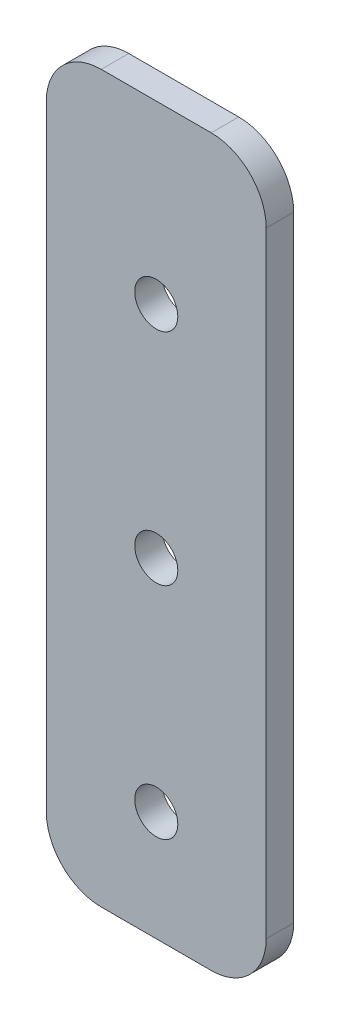
ISO-10303-21;
HEADER;
FILE_DESCRIPTION(('STEP AP214'),'2;1');
FILE_NAME('part.step','',(''),(''),'','','');
FILE_SCHEMA(('AUTOMOTIVE_DESIGN { 1 0 10303 214 1 1 1 1 }'));
ENDSEC;
DATA;
#1=APPLICATION_CONTEXT('core data for automotive mechanical design processes');
#2=APPLICATION_PROTOCOL_DEFINITION('international standard','automotive_design',2000,#1);
#3=PRODUCT_CONTEXT('',#1,'mechanical');
#4=PRODUCT('Part','Part','',(#3));
#5=PRODUCT_RELATED_PRODUCT_CATEGORY('part','',(#4));
#6=PRODUCT_DEFINITION_FORMATION('','',#4);
#7=PRODUCT_DEFINITION_CONTEXT('part definition',#1,'design');
#8=PRODUCT_DEFINITION('design','',#6,#7);
#9=PRODUCT_DEFINITION_SHAPE('','',#8);
#10=(LENGTH_UNIT() NAMED_UNIT(*) SI_UNIT(.MILLI.,.METRE.));
#11=(NAMED_UNIT(*) PLANE_ANGLE_UNIT() SI_UNIT($,.RADIAN.));
#12=(NAMED_UNIT(*) SI_UNIT($,.STERADIAN.) SOLID_ANGLE_UNIT());
#13=UNCERTAINTY_MEASURE_WITH_UNIT(LENGTH_MEASURE(1.E-05),#10,'distance_accuracy_value','');
#14=(GEOMETRIC_REPRESENTATION_CONTEXT(3) GLOBAL_UNCERTAINTY_ASSIGNED_CONTEXT((#13)) GLOBAL_UNIT_ASSIGNED_CONTEXT((#10,
#11,#12)) REPRESENTATION_CONTEXT('',''));
#15=CARTESIAN_POINT('',(0.,0.,0.));
#16=DIRECTION('',(0.,0.,1.));
#17=DIRECTION('',(1.,0.,0.));
#18=AXIS2_PLACEMENT_3D('',#15,#16,#17);
#19=CARTESIAN_POINT('',(0.,0.,3.175));
#20=DIRECTION('',(1.,0.,0.));
#21=DIRECTION('',(0.,1.,0.));
#22=AXIS2_PLACEMENT_3D('',#19,#20,#21);
#23=PLANE('',#22);
#24=DIRECTION('',(0.,-1.,0.));
#25=VECTOR('',#24,1.);
#26=CARTESIAN_POINT('',(0.,0.,0.));
#27=LINE('',#26,#25);
#28=CARTESIAN_POINT('',(0.,77.47,0.));
#29=VERTEX_POINT('',#28);
#30=CARTESIAN_POINT('',(0.,6.35,0.));
#31=VERTEX_POINT('',#30);
#32=EDGE_CURVE('E163',#29,#31,#27,.T.);
#33=ORIENTED_EDGE('',*,*,#32,.T.);
#34=DIRECTION('',(0.,0.,-1.));
#35=VECTOR('',#34,1.);
#36=CARTESIAN_POINT('',(0.,6.35,3.175));
#37=LINE('',#36,#35);
#38=CARTESIAN_POINT('',(0.,6.35,3.175));
#39=VERTEX_POINT('',#38);
#40=EDGE_CURVE('E11',#31,#39,#37,.F.);
#41=ORIENTED_EDGE('',*,*,#40,.T.);
#42=DIRECTION('',(0.,-1.,0.));
#43=VECTOR('',#42,1.);
#44=CARTESIAN_POINT('',(0.,0.,3.175));
#45=LINE('',#44,#43);
#46=CARTESIAN_POINT('',(0.,77.47,3.175));
#47=VERTEX_POINT('',#46);
#48=EDGE_CURVE('E131',#47,#39,#45,.T.);
#49=ORIENTED_EDGE('',*,*,#48,.F.);
#50=DIRECTION('',(0.,0.,-1.));
#51=VECTOR('',#50,1.);
#52=CARTESIAN_POINT('',(0.,77.47,3.175));
#53=LINE('',#52,#51);
#54=EDGE_CURVE('E47',#47,#29,#53,.T.);
#55=ORIENTED_EDGE('',*,*,#54,.T.);
#56=EDGE_LOOP('',(#33,#41,#49,#55));
#57=FACE_BOUND('',#56,.T.);
#58=ADVANCED_FACE('F39',(#57),#23,.F.);
#59=CARTESIAN_POINT('',(0.,0.,3.175));
#60=DIRECTION('',(0.,1.,0.));
#61=DIRECTION('',(0.,0.,1.));
#62=AXIS2_PLACEMENT_3D('',#59,#60,#61);
#63=PLANE('',#62);
#64=DIRECTION('',(1.,0.,0.));
#65=VECTOR('',#64,1.);
#66=CARTESIAN_POINT('',(0.,0.,0.));
#67=LINE('',#66,#65);
#68=CARTESIAN_POINT('',(6.35,0.,0.));
#69=VERTEX_POINT('',#68);
#70=CARTESIAN_POINT('',(19.05,0.,0.));
#71=VERTEX_POINT('',#70);
#72=EDGE_CURVE('E136',#69,#71,#67,.T.);
#73=ORIENTED_EDGE('',*,*,#72,.T.);
#74=DIRECTION('',(0.,0.,-1.));
#75=VECTOR('',#74,1.);
#76=CARTESIAN_POINT('',(19.05,0.,3.175));
#77=LINE('',#76,#75);
#78=CARTESIAN_POINT('',(19.05,0.,3.175));
#79=VERTEX_POINT('',#78);
#80=EDGE_CURVE('E54',#71,#79,#77,.F.);
#81=ORIENTED_EDGE('',*,*,#80,.T.);
#82=DIRECTION('',(1.,0.,0.));
#83=VECTOR('',#82,1.);
#84=CARTESIAN_POINT('',(0.,0.,3.175));
#85=LINE('',#84,#83);
#86=CARTESIAN_POINT('',(6.35,0.,3.175));
#87=VERTEX_POINT('',#86);
#88=EDGE_CURVE('E134',#87,#79,#85,.T.);
#89=ORIENTED_EDGE('',*,*,#88,.F.);
#90=DIRECTION('',(0.,0.,-1.));
#91=VECTOR('',#90,1.);
#92=CARTESIAN_POINT('',(6.35,0.,3.175));
#93=LINE('',#92,#91);
#94=EDGE_CURVE('E155',#87,#69,#93,.T.);
#95=ORIENTED_EDGE('',*,*,#94,.T.);
#96=EDGE_LOOP('',(#73,#81,#89,#95));
#97=FACE_BOUND('',#96,.T.);
#98=ADVANCED_FACE('F210',(#97),#63,.F.);
#99=CARTESIAN_POINT('',(25.4,0.,3.175));
#100=DIRECTION('',(-1.,0.,0.));
#101=DIRECTION('',(0.,-1.,0.));
#102=AXIS2_PLACEMENT_3D('',#99,#100,#101);
#103=PLANE('',#102);
#104=DIRECTION('',(0.,1.,0.));
#105=VECTOR('',#104,1.);
#106=CARTESIAN_POINT('',(25.4,0.,0.));
#107=LINE('',#106,#105);
#108=CARTESIAN_POINT('',(25.4,6.35,0.));
#109=VERTEX_POINT('',#108);
#110=CARTESIAN_POINT('',(25.4,77.47,0.));
#111=VERTEX_POINT('',#110);
#112=EDGE_CURVE('E132',#109,#111,#107,.T.);
#113=ORIENTED_EDGE('',*,*,#112,.T.);
#114=DIRECTION('',(0.,0.,-1.));
#115=VECTOR('',#114,1.);
#116=CARTESIAN_POINT('',(25.4,77.47,3.175));
#117=LINE('',#116,#115);
#118=CARTESIAN_POINT('',(25.4,77.47,3.175));
#119=VERTEX_POINT('',#118);
#120=EDGE_CURVE('E110',#111,#119,#117,.F.);
#121=ORIENTED_EDGE('',*,*,#120,.T.);
#122=DIRECTION('',(0.,1.,0.));
#123=VECTOR('',#122,1.);
#124=CARTESIAN_POINT('',(25.4,0.,3.175));
#125=LINE('',#124,#123);
#126=CARTESIAN_POINT('',(25.4,6.35,3.175));
#127=VERTEX_POINT('',#126);
#128=EDGE_CURVE('E175',#127,#119,#125,.T.);
#129=ORIENTED_EDGE('',*,*,#128,.F.);
#130=DIRECTION('',(0.,0.,-1.));
#131=VECTOR('',#130,1.);
#132=CARTESIAN_POINT('',(25.4,6.35,3.175));
#133=LINE('',#132,#131);
#134=EDGE_CURVE('E115',#127,#109,#133,.T.);
#135=ORIENTED_EDGE('',*,*,#134,.T.);
#136=EDGE_LOOP('',(#113,#121,#129,#135));
#137=FACE_BOUND('',#136,.T.);
#138=ADVANCED_FACE('F207',(#137),#103,.F.);
#139=CARTESIAN_POINT('',(0.,83.82,3.175));
#140=DIRECTION('',(0.,-1.,0.));
#141=DIRECTION('',(0.,0.,-1.));
#142=AXIS2_PLACEMENT_3D('',#139,#140,#141);
#143=PLANE('',#142);
#144=DIRECTION('',(-1.,0.,0.));
#145=VECTOR('',#144,1.);
#146=CARTESIAN_POINT('',(0.,83.82,3.175));
#147=LINE('',#146,#145);
#148=CARTESIAN_POINT('',(19.05,83.82,3.175));
#149=VERTEX_POINT('',#148);
#150=CARTESIAN_POINT('',(6.34999999999999,83.82,3.175));
#151=VERTEX_POINT('',#150);
#152=EDGE_CURVE('E125',#149,#151,#147,.T.);
#153=ORIENTED_EDGE('',*,*,#152,.F.);
#154=DIRECTION('',(0.,0.,-1.));
#155=VECTOR('',#154,1.);
#156=CARTESIAN_POINT('',(19.05,83.82,3.175));
#157=LINE('',#156,#155);
#158=CARTESIAN_POINT('',(19.05,83.82,0.));
#159=VERTEX_POINT('',#158);
#160=EDGE_CURVE('E109',#149,#159,#157,.T.);
#161=ORIENTED_EDGE('',*,*,#160,.T.);
#162=DIRECTION('',(-1.,0.,0.));
#163=VECTOR('',#162,1.);
#164=CARTESIAN_POINT('',(0.,83.82,0.));
#165=LINE('',#164,#163);
#166=CARTESIAN_POINT('',(6.34999999999999,83.82,0.));
#167=VERTEX_POINT('',#166);
#168=EDGE_CURVE('E122',#159,#167,#165,.T.);
#169=ORIENTED_EDGE('',*,*,#168,.T.);
#170=DIRECTION('',(0.,0.,-1.));
#171=VECTOR('',#170,1.);
#172=CARTESIAN_POINT('',(6.34999999999999,83.82,3.175));
#173=LINE('',#172,#171);
#174=EDGE_CURVE('E127',#167,#151,#173,.F.);
#175=ORIENTED_EDGE('',*,*,#174,.T.);
#176=EDGE_LOOP('',(#153,#161,#169,#175));
#177=FACE_BOUND('',#176,.T.);
#178=ADVANCED_FACE('F121',(#177),#143,.F.);
#179=CARTESIAN_POINT('',(0.,0.,3.175));
#180=DIRECTION('',(0.,0.,-1.));
#181=DIRECTION('',(-1.,0.,0.));
#182=AXIS2_PLACEMENT_3D('',#179,#180,#181);
#183=PLANE('',#182);
#184=CARTESIAN_POINT('',(12.7,12.7,3.175));
#185=DIRECTION('',(0.,0.,1.));
#186=DIRECTION('',(1.,0.,0.));
#187=AXIS2_PLACEMENT_3D('',#184,#185,#186);
#188=CIRCLE('',#187,2.4892);
#189=CARTESIAN_POINT('',(15.1892,12.7,3.175));
#190=VERTEX_POINT('',#189);
#191=EDGE_CURVE('E171',#190,#190,#188,.T.);
#192=ORIENTED_EDGE('',*,*,#191,.F.);
#193=EDGE_LOOP('',(#192));
#194=FACE_BOUND('',#193,.T.);
#195=CARTESIAN_POINT('',(12.7,38.1,3.175));
#196=DIRECTION('',(0.,0.,1.));
#197=DIRECTION('',(1.,0.,0.));
#198=AXIS2_PLACEMENT_3D('',#195,#196,#197);
#199=CIRCLE('',#198,2.4892);
#200=CARTESIAN_POINT('',(15.1892,38.1,3.175));
#201=VERTEX_POINT('',#200);
#202=EDGE_CURVE('E188',#201,#201,#199,.T.);
#203=ORIENTED_EDGE('',*,*,#202,.F.);
#204=EDGE_LOOP('',(#203));
#205=FACE_BOUND('',#204,.T.);
#206=CARTESIAN_POINT('',(12.7,63.5,3.175));
#207=DIRECTION('',(0.,0.,1.));
#208=DIRECTION('',(1.,0.,0.));
#209=AXIS2_PLACEMENT_3D('',#206,#207,#208);
#210=CIRCLE('',#209,2.4892);
#211=CARTESIAN_POINT('',(15.1892,63.5,3.175));
#212=VERTEX_POINT('',#211);
#213=EDGE_CURVE('E182',#212,#212,#210,.T.);
#214=ORIENTED_EDGE('',*,*,#213,.F.);
#215=EDGE_LOOP('',(#214));
#216=FACE_BOUND('',#215,.T.);
#217=ORIENTED_EDGE('',*,*,#128,.T.);
#218=CARTESIAN_POINT('',(19.05,77.47,3.175));
#219=DIRECTION('',(0.,0.,-1.));
#220=DIRECTION('',(-1.,0.,0.));
#221=AXIS2_PLACEMENT_3D('',#218,#219,#220);
#222=CIRCLE('',#221,6.35);
#223=EDGE_CURVE('E153',#119,#149,#222,.F.);
#224=ORIENTED_EDGE('',*,*,#223,.T.);
#225=ORIENTED_EDGE('',*,*,#152,.T.);
#226=CARTESIAN_POINT('',(6.34999999999999,77.47,3.175));
#227=DIRECTION('',(0.,0.,-1.));
#228=DIRECTION('',(-1.,0.,0.));
#229=AXIS2_PLACEMENT_3D('',#226,#227,#228);
#230=CIRCLE('',#229,6.35);
#231=EDGE_CURVE('E148',#151,#47,#230,.F.);
#232=ORIENTED_EDGE('',*,*,#231,.T.);
#233=ORIENTED_EDGE('',*,*,#48,.T.);
#234=CARTESIAN_POINT('',(6.35,6.35,3.175));
#235=DIRECTION('',(0.,0.,-1.));
#236=DIRECTION('',(-1.,0.,0.));
#237=AXIS2_PLACEMENT_3D('',#234,#235,#236);
#238=CIRCLE('',#237,6.35);
#239=EDGE_CURVE('E61',#39,#87,#238,.F.);
#240=ORIENTED_EDGE('',*,*,#239,.T.);
#241=ORIENTED_EDGE('',*,*,#88,.T.);
#242=CARTESIAN_POINT('',(19.05,6.35,3.175));
#243=DIRECTION('',(0.,0.,-1.));
#244=DIRECTION('',(-1.,0.,0.));
#245=AXIS2_PLACEMENT_3D('',#242,#243,#244);
#246=CIRCLE('',#245,6.35);
#247=EDGE_CURVE('E151',#79,#127,#246,.F.);
#248=ORIENTED_EDGE('',*,*,#247,.T.);
#249=EDGE_LOOP('',(#217,#224,#225,#232,#233,#240,#241,#248));
#250=FACE_BOUND('',#249,.T.);
#251=ADVANCED_FACE('F196',(#194,#205,#216,#250),#183,.F.);
#252=CARTESIAN_POINT('',(0.,0.,0.));
#253=DIRECTION('',(0.,0.,-1.));
#254=DIRECTION('',(-1.,0.,0.));
#255=AXIS2_PLACEMENT_3D('',#252,#253,#254);
#256=PLANE('',#255);
#257=CARTESIAN_POINT('',(12.7,12.7,0.));
#258=DIRECTION('',(0.,0.,1.));
#259=DIRECTION('',(1.,0.,0.));
#260=AXIS2_PLACEMENT_3D('',#257,#258,#259);
#261=CIRCLE('',#260,2.4892);
#262=CARTESIAN_POINT('',(15.1892,12.7,0.));
#263=VERTEX_POINT('',#262);
#264=EDGE_CURVE('E168',#263,#263,#261,.T.);
#265=ORIENTED_EDGE('',*,*,#264,.T.);
#266=EDGE_LOOP('',(#265));
#267=FACE_BOUND('',#266,.T.);
#268=CARTESIAN_POINT('',(12.7,38.1,0.));
#269=DIRECTION('',(0.,0.,1.));
#270=DIRECTION('',(1.,0.,0.));
#271=AXIS2_PLACEMENT_3D('',#268,#269,#270);
#272=CIRCLE('',#271,2.4892);
#273=CARTESIAN_POINT('',(15.1892,38.1,0.));
#274=VERTEX_POINT('',#273);
#275=EDGE_CURVE('E185',#274,#274,#272,.T.);
#276=ORIENTED_EDGE('',*,*,#275,.T.);
#277=EDGE_LOOP('',(#276));
#278=FACE_BOUND('',#277,.T.);
#279=CARTESIAN_POINT('',(12.7,63.5,0.));
#280=DIRECTION('',(0.,0.,1.));
#281=DIRECTION('',(1.,0.,0.));
#282=AXIS2_PLACEMENT_3D('',#279,#280,#281);
#283=CIRCLE('',#282,2.4892);
#284=CARTESIAN_POINT('',(15.1892,63.5,0.));
#285=VERTEX_POINT('',#284);
#286=EDGE_CURVE('E179',#285,#285,#283,.T.);
#287=ORIENTED_EDGE('',*,*,#286,.T.);
#288=EDGE_LOOP('',(#287));
#289=FACE_BOUND('',#288,.T.);
#290=ORIENTED_EDGE('',*,*,#168,.F.);
#291=CARTESIAN_POINT('',(19.05,77.47,0.));
#292=DIRECTION('',(0.,0.,-1.));
#293=DIRECTION('',(-1.,0.,0.));
#294=AXIS2_PLACEMENT_3D('',#291,#292,#293);
#295=CIRCLE('',#294,6.35);
#296=EDGE_CURVE('E105',#159,#111,#295,.T.);
#297=ORIENTED_EDGE('',*,*,#296,.T.);
#298=ORIENTED_EDGE('',*,*,#112,.F.);
#299=CARTESIAN_POINT('',(19.05,6.35,0.));
#300=DIRECTION('',(0.,0.,-1.));
#301=DIRECTION('',(-1.,0.,0.));
#302=AXIS2_PLACEMENT_3D('',#299,#300,#301);
#303=CIRCLE('',#302,6.35);
#304=EDGE_CURVE('E116',#109,#71,#303,.T.);
#305=ORIENTED_EDGE('',*,*,#304,.T.);
#306=ORIENTED_EDGE('',*,*,#72,.F.);
#307=CARTESIAN_POINT('',(6.35,6.35,0.));
#308=DIRECTION('',(0.,0.,-1.));
#309=DIRECTION('',(-1.,0.,0.));
#310=AXIS2_PLACEMENT_3D('',#307,#308,#309);
#311=CIRCLE('',#310,6.35);
#312=EDGE_CURVE('E142',#69,#31,#311,.T.);
#313=ORIENTED_EDGE('',*,*,#312,.T.);
#314=ORIENTED_EDGE('',*,*,#32,.F.);
#315=CARTESIAN_POINT('',(6.34999999999999,77.47,0.));
#316=DIRECTION('',(0.,0.,-1.));
#317=DIRECTION('',(-1.,0.,0.));
#318=AXIS2_PLACEMENT_3D('',#315,#316,#317);
#319=CIRCLE('',#318,6.35);
#320=EDGE_CURVE('E126',#29,#167,#319,.T.);
#321=ORIENTED_EDGE('',*,*,#320,.T.);
#322=EDGE_LOOP('',(#290,#297,#298,#305,#306,#313,#314,#321));
#323=FACE_BOUND('',#322,.T.);
#324=ADVANCED_FACE('F129',(#267,#278,#289,#323),#256,.T.);
#325=CARTESIAN_POINT('',(12.7,63.5,0.));
#326=DIRECTION('',(0.,0.,1.));
#327=DIRECTION('',(1.,0.,0.));
#328=AXIS2_PLACEMENT_3D('',#325,#326,#327);
#329=CYLINDRICAL_SURFACE('',#328,2.4892);
#330=ORIENTED_EDGE('',*,*,#286,.F.);
#331=EDGE_LOOP('',(#330));
#332=FACE_BOUND('',#331,.T.);
#333=ORIENTED_EDGE('',*,*,#213,.T.);
#334=EDGE_LOOP('',(#333));
#335=FACE_BOUND('',#334,.T.);
#336=ADVANCED_FACE('F266',(#332,#335),#329,.F.);
#337=CARTESIAN_POINT('',(12.7,38.1,0.));
#338=DIRECTION('',(0.,0.,1.));
#339=DIRECTION('',(1.,0.,0.));
#340=AXIS2_PLACEMENT_3D('',#337,#338,#339);
#341=CYLINDRICAL_SURFACE('',#340,2.4892);
#342=ORIENTED_EDGE('',*,*,#275,.F.);
#343=EDGE_LOOP('',(#342));
#344=FACE_BOUND('',#343,.T.);
#345=ORIENTED_EDGE('',*,*,#202,.T.);
#346=EDGE_LOOP('',(#345));
#347=FACE_BOUND('',#346,.T.);
#348=ADVANCED_FACE('F257',(#344,#347),#341,.F.);
#349=CARTESIAN_POINT('',(12.7,12.7,0.));
#350=DIRECTION('',(0.,0.,1.));
#351=DIRECTION('',(1.,0.,0.));
#352=AXIS2_PLACEMENT_3D('',#349,#350,#351);
#353=CYLINDRICAL_SURFACE('',#352,2.4892);
#354=ORIENTED_EDGE('',*,*,#264,.F.);
#355=EDGE_LOOP('',(#354));
#356=FACE_BOUND('',#355,.T.);
#357=ORIENTED_EDGE('',*,*,#191,.T.);
#358=EDGE_LOOP('',(#357));
#359=FACE_BOUND('',#358,.T.);
#360=ADVANCED_FACE('F194',(#356,#359),#353,.F.);
#361=CARTESIAN_POINT('',(19.05,77.47,3.175));
#362=DIRECTION('',(0.,0.,-1.));
#363=DIRECTION('',(-1.,0.,0.));
#364=AXIS2_PLACEMENT_3D('',#361,#362,#363);
#365=CYLINDRICAL_SURFACE('',#364,6.35);
#366=ORIENTED_EDGE('',*,*,#223,.F.);
#367=ORIENTED_EDGE('',*,*,#120,.F.);
#368=ORIENTED_EDGE('',*,*,#296,.F.);
#369=ORIENTED_EDGE('',*,*,#160,.F.);
#370=EDGE_LOOP('',(#366,#367,#368,#369));
#371=FACE_BOUND('',#370,.T.);
#372=ADVANCED_FACE('F108',(#371),#365,.T.);
#373=CARTESIAN_POINT('',(19.05,6.35,3.175));
#374=DIRECTION('',(0.,0.,-1.));
#375=DIRECTION('',(-1.,0.,0.));
#376=AXIS2_PLACEMENT_3D('',#373,#374,#375);
#377=CYLINDRICAL_SURFACE('',#376,6.35);
#378=ORIENTED_EDGE('',*,*,#247,.F.);
#379=ORIENTED_EDGE('',*,*,#80,.F.);
#380=ORIENTED_EDGE('',*,*,#304,.F.);
#381=ORIENTED_EDGE('',*,*,#134,.F.);
#382=EDGE_LOOP('',(#378,#379,#380,#381));
#383=FACE_BOUND('',#382,.T.);
#384=ADVANCED_FACE('F209',(#383),#377,.T.);
#385=CARTESIAN_POINT('',(6.35,6.35,3.175));
#386=DIRECTION('',(0.,0.,-1.));
#387=DIRECTION('',(-1.,0.,0.));
#388=AXIS2_PLACEMENT_3D('',#385,#386,#387);
#389=CYLINDRICAL_SURFACE('',#388,6.35);
#390=ORIENTED_EDGE('',*,*,#239,.F.);
#391=ORIENTED_EDGE('',*,*,#40,.F.);
#392=ORIENTED_EDGE('',*,*,#312,.F.);
#393=ORIENTED_EDGE('',*,*,#94,.F.);
#394=EDGE_LOOP('',(#390,#391,#392,#393));
#395=FACE_BOUND('',#394,.T.);
#396=ADVANCED_FACE('F213',(#395),#389,.T.);
#397=CARTESIAN_POINT('',(6.34999999999999,77.47,3.175));
#398=DIRECTION('',(0.,0.,-1.));
#399=DIRECTION('',(-1.,0.,0.));
#400=AXIS2_PLACEMENT_3D('',#397,#398,#399);
#401=CYLINDRICAL_SURFACE('',#400,6.35);
#402=ORIENTED_EDGE('',*,*,#231,.F.);
#403=ORIENTED_EDGE('',*,*,#174,.F.);
#404=ORIENTED_EDGE('',*,*,#320,.F.);
#405=ORIENTED_EDGE('',*,*,#54,.F.);
#406=EDGE_LOOP('',(#402,#403,#404,#405));
#407=FACE_BOUND('',#406,.T.);
#408=ADVANCED_FACE('F41',(#407),#401,.T.);
#409=CLOSED_SHELL('',(#58,#98,#138,#178,#251,#324,#336,#348,#360,#372,#384,#396,#408));
#410=MANIFOLD_SOLID_BREP('B2',#409);
#411=ADVANCED_BREP_SHAPE_REPRESENTATION('',(#18,#410),#14);
#412=SHAPE_DEFINITION_REPRESENTATION(#9,#411);
ENDSEC;
END-ISO-10303-21;
